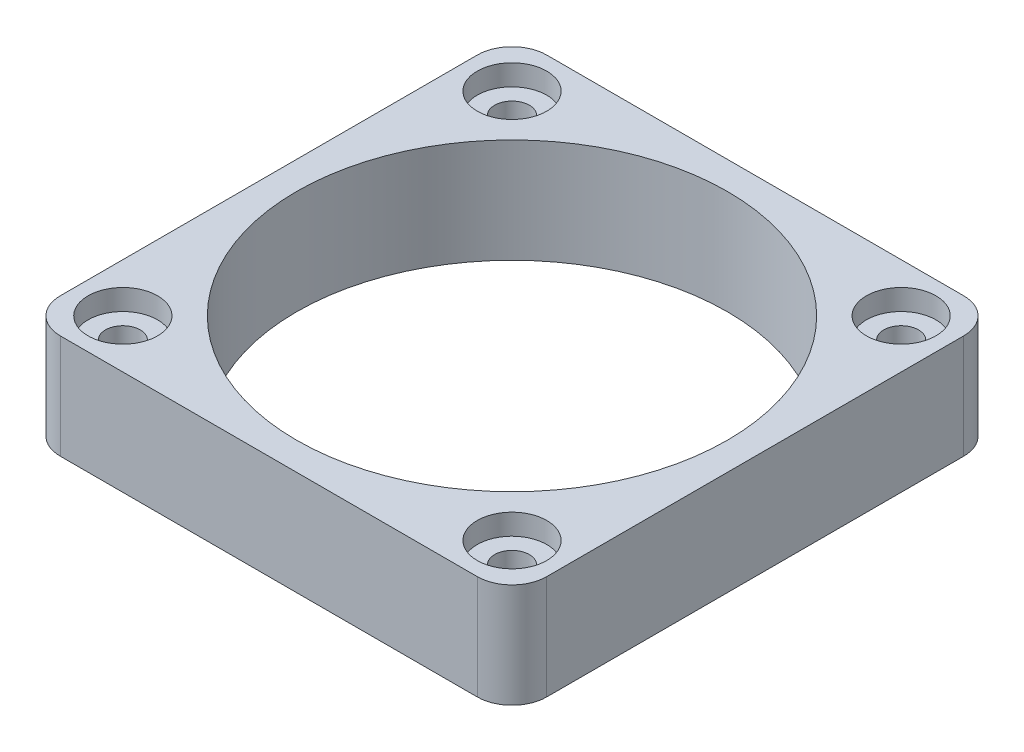
ISO-10303-21;
HEADER;
FILE_DESCRIPTION(('STEP AP214'),'2;1');
FILE_NAME('part.step','',(''),(''),'','','');
FILE_SCHEMA(('AUTOMOTIVE_DESIGN { 1 0 10303 214 1 1 1 1 }'));
ENDSEC;
DATA;
#1=APPLICATION_CONTEXT('core data for automotive mechanical design processes');
#2=APPLICATION_PROTOCOL_DEFINITION('international standard','automotive_design',2000,#1);
#3=PRODUCT_CONTEXT('',#1,'mechanical');
#4=PRODUCT('Part','Part','',(#3));
#5=PRODUCT_RELATED_PRODUCT_CATEGORY('part','',(#4));
#6=PRODUCT_DEFINITION_FORMATION('','',#4);
#7=PRODUCT_DEFINITION_CONTEXT('part definition',#1,'design');
#8=PRODUCT_DEFINITION('design','',#6,#7);
#9=PRODUCT_DEFINITION_SHAPE('','',#8);
#10=(LENGTH_UNIT() NAMED_UNIT(*) SI_UNIT(.MILLI.,.METRE.));
#11=(NAMED_UNIT(*) PLANE_ANGLE_UNIT() SI_UNIT($,.RADIAN.));
#12=(NAMED_UNIT(*) SI_UNIT($,.STERADIAN.) SOLID_ANGLE_UNIT());
#13=UNCERTAINTY_MEASURE_WITH_UNIT(LENGTH_MEASURE(1.E-05),#10,'distance_accuracy_value','');
#14=(GEOMETRIC_REPRESENTATION_CONTEXT(3) GLOBAL_UNCERTAINTY_ASSIGNED_CONTEXT((#13)) GLOBAL_UNIT_ASSIGNED_CONTEXT((#10,
#11,#12)) REPRESENTATION_CONTEXT('',''));
#15=CARTESIAN_POINT('',(0.,0.,0.));
#16=DIRECTION('',(0.,0.,1.));
#17=DIRECTION('',(1.,0.,0.));
#18=AXIS2_PLACEMENT_3D('',#15,#16,#17);
#19=CARTESIAN_POINT('',(-28.,0.,-28.));
#20=DIRECTION('',(0.,1.,0.));
#21=DIRECTION('',(0.,0.,1.));
#22=AXIS2_PLACEMENT_3D('',#19,#20,#21);
#23=CYLINDRICAL_SURFACE('',#22,2.5);
#24=CARTESIAN_POINT('',(-28.,0.,-28.));
#25=DIRECTION('',(0.,1.,0.));
#26=DIRECTION('',(0.,0.,1.));
#27=AXIS2_PLACEMENT_3D('',#24,#25,#26);
#28=CIRCLE('',#27,2.5);
#29=CARTESIAN_POINT('',(-28.,0.,-25.5));
#30=VERTEX_POINT('',#29);
#31=EDGE_CURVE('E213',#30,#30,#28,.T.);
#32=ORIENTED_EDGE('',*,*,#31,.F.);
#33=EDGE_LOOP('',(#32));
#34=FACE_BOUND('',#33,.T.);
#35=CARTESIAN_POINT('',(-28.,12.,-28.));
#36=DIRECTION('',(0.,1.,0.));
#37=DIRECTION('',(0.,0.,1.));
#38=AXIS2_PLACEMENT_3D('',#35,#36,#37);
#39=CIRCLE('',#38,2.5);
#40=CARTESIAN_POINT('',(-28.,12.,-25.5));
#41=VERTEX_POINT('',#40);
#42=EDGE_CURVE('E43',#41,#41,#39,.F.);
#43=ORIENTED_EDGE('',*,*,#42,.F.);
#44=EDGE_LOOP('',(#43));
#45=FACE_BOUND('',#44,.T.);
#46=ADVANCED_FACE('F39',(#34,#45),#23,.F.);
#47=CARTESIAN_POINT('',(28.,0.,28.));
#48=DIRECTION('',(0.,1.,0.));
#49=DIRECTION('',(0.,0.,1.));
#50=AXIS2_PLACEMENT_3D('',#47,#48,#49);
#51=CYLINDRICAL_SURFACE('',#50,2.50000000000001);
#52=CARTESIAN_POINT('',(28.,0.,28.));
#53=DIRECTION('',(0.,1.,0.));
#54=DIRECTION('',(0.,0.,1.));
#55=AXIS2_PLACEMENT_3D('',#52,#53,#54);
#56=CIRCLE('',#55,2.50000000000001);
#57=CARTESIAN_POINT('',(28.,0.,30.5));
#58=VERTEX_POINT('',#57);
#59=EDGE_CURVE('E203',#58,#58,#56,.T.);
#60=ORIENTED_EDGE('',*,*,#59,.F.);
#61=EDGE_LOOP('',(#60));
#62=FACE_BOUND('',#61,.T.);
#63=CARTESIAN_POINT('',(28.,12.,28.));
#64=DIRECTION('',(0.,1.,0.));
#65=DIRECTION('',(0.,0.,1.));
#66=AXIS2_PLACEMENT_3D('',#63,#64,#65);
#67=CIRCLE('',#66,2.50000000000001);
#68=CARTESIAN_POINT('',(28.,12.,30.5));
#69=VERTEX_POINT('',#68);
#70=EDGE_CURVE('E187',#69,#69,#67,.F.);
#71=ORIENTED_EDGE('',*,*,#70,.F.);
#72=EDGE_LOOP('',(#71));
#73=FACE_BOUND('',#72,.T.);
#74=ADVANCED_FACE('F262',(#62,#73),#51,.F.);
#75=CARTESIAN_POINT('',(0.,15.,0.));
#76=DIRECTION('',(0.,1.,0.));
#77=DIRECTION('',(0.,0.,1.));
#78=AXIS2_PLACEMENT_3D('',#75,#76,#77);
#79=PLANE('',#78);
#80=CARTESIAN_POINT('',(-28.,15.,28.));
#81=DIRECTION('',(0.,1.,0.));
#82=DIRECTION('',(0.,0.,-1.));
#83=AXIS2_PLACEMENT_3D('',#80,#81,#82);
#84=CIRCLE('',#83,5.);
#85=CARTESIAN_POINT('',(-28.,15.,23.));
#86=VERTEX_POINT('',#85);
#87=EDGE_CURVE('E374',#86,#86,#84,.T.);
#88=ORIENTED_EDGE('',*,*,#87,.F.);
#89=EDGE_LOOP('',(#88));
#90=FACE_BOUND('',#89,.T.);
#91=CARTESIAN_POINT('',(28.,15.,-28.));
#92=DIRECTION('',(0.,1.,0.));
#93=DIRECTION('',(0.,0.,-1.));
#94=AXIS2_PLACEMENT_3D('',#91,#92,#93);
#95=CIRCLE('',#94,5.);
#96=CARTESIAN_POINT('',(28.,15.,-33.));
#97=VERTEX_POINT('',#96);
#98=EDGE_CURVE('E358',#97,#97,#95,.T.);
#99=ORIENTED_EDGE('',*,*,#98,.F.);
#100=EDGE_LOOP('',(#99));
#101=FACE_BOUND('',#100,.T.);
#102=CARTESIAN_POINT('',(28.,15.,28.));
#103=DIRECTION('',(0.,1.,0.));
#104=DIRECTION('',(0.,0.,1.));
#105=AXIS2_PLACEMENT_3D('',#102,#103,#104);
#106=CIRCLE('',#105,5.);
#107=CARTESIAN_POINT('',(28.,15.,33.));
#108=VERTEX_POINT('',#107);
#109=EDGE_CURVE('E359',#108,#108,#106,.T.);
#110=ORIENTED_EDGE('',*,*,#109,.F.);
#111=EDGE_LOOP('',(#110));
#112=FACE_BOUND('',#111,.T.);
#113=CARTESIAN_POINT('',(-28.,15.,-28.));
#114=DIRECTION('',(0.,1.,0.));
#115=DIRECTION('',(0.,0.,1.));
#116=AXIS2_PLACEMENT_3D('',#113,#114,#115);
#117=CIRCLE('',#116,5.);
#118=CARTESIAN_POINT('',(-28.,15.,-23.));
#119=VERTEX_POINT('',#118);
#120=EDGE_CURVE('E373',#119,#119,#117,.T.);
#121=ORIENTED_EDGE('',*,*,#120,.F.);
#122=EDGE_LOOP('',(#121));
#123=FACE_BOUND('',#122,.T.);
#124=DIRECTION('',(-1.,0.,0.));
#125=VECTOR('',#124,1.);
#126=CARTESIAN_POINT('',(-35.,15.,-35.));
#127=LINE('',#126,#125);
#128=CARTESIAN_POINT('',(30.,15.,-35.));
#129=VERTEX_POINT('',#128);
#130=CARTESIAN_POINT('',(-30.,15.,-35.));
#131=VERTEX_POINT('',#130);
#132=EDGE_CURVE('E228',#129,#131,#127,.T.);
#133=ORIENTED_EDGE('',*,*,#132,.T.);
#134=CARTESIAN_POINT('',(-30.,15.,-30.));
#135=DIRECTION('',(0.,1.,0.));
#136=DIRECTION('',(0.,0.,1.));
#137=AXIS2_PLACEMENT_3D('',#134,#135,#136);
#138=CIRCLE('',#137,5.);
#139=CARTESIAN_POINT('',(-35.,15.,-30.));
#140=VERTEX_POINT('',#139);
#141=EDGE_CURVE('E170',#131,#140,#138,.T.);
#142=ORIENTED_EDGE('',*,*,#141,.T.);
#143=DIRECTION('',(0.,0.,1.));
#144=VECTOR('',#143,1.);
#145=CARTESIAN_POINT('',(-35.,15.,-35.));
#146=LINE('',#145,#144);
#147=CARTESIAN_POINT('',(-35.,15.,30.));
#148=VERTEX_POINT('',#147);
#149=EDGE_CURVE('E127',#140,#148,#146,.T.);
#150=ORIENTED_EDGE('',*,*,#149,.T.);
#151=CARTESIAN_POINT('',(-30.,15.,30.));
#152=DIRECTION('',(0.,1.,0.));
#153=DIRECTION('',(0.,0.,1.));
#154=AXIS2_PLACEMENT_3D('',#151,#152,#153);
#155=CIRCLE('',#154,5.);
#156=CARTESIAN_POINT('',(-30.,15.,35.));
#157=VERTEX_POINT('',#156);
#158=EDGE_CURVE('E62',#148,#157,#155,.T.);
#159=ORIENTED_EDGE('',*,*,#158,.T.);
#160=DIRECTION('',(1.,0.,0.));
#161=VECTOR('',#160,1.);
#162=CARTESIAN_POINT('',(-35.,15.,35.));
#163=LINE('',#162,#161);
#164=CARTESIAN_POINT('',(30.,15.,35.));
#165=VERTEX_POINT('',#164);
#166=EDGE_CURVE('E148',#157,#165,#163,.T.);
#167=ORIENTED_EDGE('',*,*,#166,.T.);
#168=CARTESIAN_POINT('',(30.,15.,30.));
#169=DIRECTION('',(0.,1.,0.));
#170=DIRECTION('',(0.,0.,1.));
#171=AXIS2_PLACEMENT_3D('',#168,#169,#170);
#172=CIRCLE('',#171,5.);
#173=CARTESIAN_POINT('',(35.,15.,30.));
#174=VERTEX_POINT('',#173);
#175=EDGE_CURVE('E164',#165,#174,#172,.T.);
#176=ORIENTED_EDGE('',*,*,#175,.T.);
#177=DIRECTION('',(0.,0.,-1.));
#178=VECTOR('',#177,1.);
#179=CARTESIAN_POINT('',(35.,15.,-35.));
#180=LINE('',#179,#178);
#181=CARTESIAN_POINT('',(35.,15.,-30.));
#182=VERTEX_POINT('',#181);
#183=EDGE_CURVE('E141',#174,#182,#180,.T.);
#184=ORIENTED_EDGE('',*,*,#183,.T.);
#185=CARTESIAN_POINT('',(30.,15.,-30.));
#186=DIRECTION('',(0.,1.,0.));
#187=DIRECTION('',(0.,0.,1.));
#188=AXIS2_PLACEMENT_3D('',#185,#186,#187);
#189=CIRCLE('',#188,5.);
#190=EDGE_CURVE('E167',#182,#129,#189,.T.);
#191=ORIENTED_EDGE('',*,*,#190,.T.);
#192=EDGE_LOOP('',(#133,#142,#150,#159,#167,#176,#184,#191));
#193=FACE_BOUND('',#192,.T.);
#194=CARTESIAN_POINT('',(0.,15.,0.));
#195=DIRECTION('',(0.,1.,0.));
#196=DIRECTION('',(0.,0.,1.));
#197=AXIS2_PLACEMENT_3D('',#194,#195,#196);
#198=CIRCLE('',#197,31.);
#199=CARTESIAN_POINT('',(0.,15.,31.));
#200=VERTEX_POINT('',#199);
#201=EDGE_CURVE('E218',#200,#200,#198,.T.);
#202=ORIENTED_EDGE('',*,*,#201,.F.);
#203=EDGE_LOOP('',(#202));
#204=FACE_BOUND('',#203,.T.);
#205=ADVANCED_FACE('F248',(#90,#101,#112,#123,#193,#204),#79,.T.);
#206=CARTESIAN_POINT('',(0.,0.,0.));
#207=DIRECTION('',(0.,1.,0.));
#208=DIRECTION('',(0.,0.,1.));
#209=AXIS2_PLACEMENT_3D('',#206,#207,#208);
#210=PLANE('',#209);
#211=CARTESIAN_POINT('',(-28.,0.,28.));
#212=DIRECTION('',(0.,1.,0.));
#213=DIRECTION('',(0.,0.,-1.));
#214=AXIS2_PLACEMENT_3D('',#211,#212,#213);
#215=CIRCLE('',#214,2.5);
#216=CARTESIAN_POINT('',(-28.,0.,25.5));
#217=VERTEX_POINT('',#216);
#218=EDGE_CURVE('E198',#217,#217,#215,.T.);
#219=ORIENTED_EDGE('',*,*,#218,.T.);
#220=EDGE_LOOP('',(#219));
#221=FACE_BOUND('',#220,.T.);
#222=ORIENTED_EDGE('',*,*,#59,.T.);
#223=EDGE_LOOP('',(#222));
#224=FACE_BOUND('',#223,.T.);
#225=CARTESIAN_POINT('',(28.,0.,-28.));
#226=DIRECTION('',(0.,1.,0.));
#227=DIRECTION('',(0.,0.,-1.));
#228=AXIS2_PLACEMENT_3D('',#225,#226,#227);
#229=CIRCLE('',#228,2.50000000000001);
#230=CARTESIAN_POINT('',(28.,0.,-30.5));
#231=VERTEX_POINT('',#230);
#232=EDGE_CURVE('E209',#231,#231,#229,.T.);
#233=ORIENTED_EDGE('',*,*,#232,.T.);
#234=EDGE_LOOP('',(#233));
#235=FACE_BOUND('',#234,.T.);
#236=ORIENTED_EDGE('',*,*,#31,.T.);
#237=EDGE_LOOP('',(#236));
#238=FACE_BOUND('',#237,.T.);
#239=DIRECTION('',(0.,0.,1.));
#240=VECTOR('',#239,1.);
#241=CARTESIAN_POINT('',(-35.,0.,-35.));
#242=LINE('',#241,#240);
#243=CARTESIAN_POINT('',(-35.,0.,-30.));
#244=VERTEX_POINT('',#243);
#245=CARTESIAN_POINT('',(-35.,0.,30.));
#246=VERTEX_POINT('',#245);
#247=EDGE_CURVE('E125',#244,#246,#242,.T.);
#248=ORIENTED_EDGE('',*,*,#247,.F.);
#249=CARTESIAN_POINT('',(-30.,0.,-30.));
#250=DIRECTION('',(0.,1.,0.));
#251=DIRECTION('',(0.,0.,1.));
#252=AXIS2_PLACEMENT_3D('',#249,#250,#251);
#253=CIRCLE('',#252,5.);
#254=CARTESIAN_POINT('',(-30.,0.,-35.));
#255=VERTEX_POINT('',#254);
#256=EDGE_CURVE('E107',#244,#255,#253,.F.);
#257=ORIENTED_EDGE('',*,*,#256,.T.);
#258=DIRECTION('',(-1.,0.,0.));
#259=VECTOR('',#258,1.);
#260=CARTESIAN_POINT('',(-35.,0.,-35.));
#261=LINE('',#260,#259);
#262=CARTESIAN_POINT('',(30.,0.,-35.));
#263=VERTEX_POINT('',#262);
#264=EDGE_CURVE('E137',#263,#255,#261,.T.);
#265=ORIENTED_EDGE('',*,*,#264,.F.);
#266=CARTESIAN_POINT('',(30.,0.,-30.));
#267=DIRECTION('',(0.,1.,0.));
#268=DIRECTION('',(0.,0.,1.));
#269=AXIS2_PLACEMENT_3D('',#266,#267,#268);
#270=CIRCLE('',#269,5.);
#271=CARTESIAN_POINT('',(35.,0.,-30.));
#272=VERTEX_POINT('',#271);
#273=EDGE_CURVE('E119',#263,#272,#270,.F.);
#274=ORIENTED_EDGE('',*,*,#273,.T.);
#275=DIRECTION('',(0.,0.,-1.));
#276=VECTOR('',#275,1.);
#277=CARTESIAN_POINT('',(35.,0.,-35.));
#278=LINE('',#277,#276);
#279=CARTESIAN_POINT('',(35.,0.,30.));
#280=VERTEX_POINT('',#279);
#281=EDGE_CURVE('E143',#280,#272,#278,.T.);
#282=ORIENTED_EDGE('',*,*,#281,.F.);
#283=CARTESIAN_POINT('',(30.,0.,30.));
#284=DIRECTION('',(0.,1.,0.));
#285=DIRECTION('',(0.,0.,1.));
#286=AXIS2_PLACEMENT_3D('',#283,#284,#285);
#287=CIRCLE('',#286,5.);
#288=CARTESIAN_POINT('',(30.,0.,35.));
#289=VERTEX_POINT('',#288);
#290=EDGE_CURVE('E152',#280,#289,#287,.F.);
#291=ORIENTED_EDGE('',*,*,#290,.T.);
#292=DIRECTION('',(1.,0.,0.));
#293=VECTOR('',#292,1.);
#294=CARTESIAN_POINT('',(-35.,0.,35.));
#295=LINE('',#294,#293);
#296=CARTESIAN_POINT('',(-30.,0.,35.));
#297=VERTEX_POINT('',#296);
#298=EDGE_CURVE('E136',#297,#289,#295,.T.);
#299=ORIENTED_EDGE('',*,*,#298,.F.);
#300=CARTESIAN_POINT('',(-30.,0.,30.));
#301=DIRECTION('',(0.,1.,0.));
#302=DIRECTION('',(0.,0.,1.));
#303=AXIS2_PLACEMENT_3D('',#300,#301,#302);
#304=CIRCLE('',#303,5.);
#305=EDGE_CURVE('E129',#297,#246,#304,.F.);
#306=ORIENTED_EDGE('',*,*,#305,.T.);
#307=EDGE_LOOP('',(#248,#257,#265,#274,#282,#291,#299,#306));
#308=FACE_BOUND('',#307,.T.);
#309=CARTESIAN_POINT('',(0.,0.,0.));
#310=DIRECTION('',(0.,1.,0.));
#311=DIRECTION('',(0.,0.,1.));
#312=AXIS2_PLACEMENT_3D('',#309,#310,#311);
#313=CIRCLE('',#312,31.);
#314=CARTESIAN_POINT('',(0.,0.,31.));
#315=VERTEX_POINT('',#314);
#316=EDGE_CURVE('E217',#315,#315,#313,.T.);
#317=ORIENTED_EDGE('',*,*,#316,.T.);
#318=EDGE_LOOP('',(#317));
#319=FACE_BOUND('',#318,.T.);
#320=ADVANCED_FACE('F132',(#221,#224,#235,#238,#308,#319),#210,.F.);
#321=CARTESIAN_POINT('',(35.,15.,-35.));
#322=DIRECTION('',(-1.,0.,0.));
#323=DIRECTION('',(0.,0.,1.));
#324=AXIS2_PLACEMENT_3D('',#321,#322,#323);
#325=PLANE('',#324);
#326=ORIENTED_EDGE('',*,*,#281,.T.);
#327=DIRECTION('',(0.,-1.,0.));
#328=VECTOR('',#327,1.);
#329=CARTESIAN_POINT('',(35.,15.,-30.));
#330=LINE('',#329,#328);
#331=EDGE_CURVE('E177',#272,#182,#330,.F.);
#332=ORIENTED_EDGE('',*,*,#331,.T.);
#333=ORIENTED_EDGE('',*,*,#183,.F.);
#334=DIRECTION('',(0.,-1.,0.));
#335=VECTOR('',#334,1.);
#336=CARTESIAN_POINT('',(35.,15.,30.));
#337=LINE('',#336,#335);
#338=EDGE_CURVE('E173',#174,#280,#337,.T.);
#339=ORIENTED_EDGE('',*,*,#338,.T.);
#340=EDGE_LOOP('',(#326,#332,#333,#339));
#341=FACE_BOUND('',#340,.T.);
#342=ADVANCED_FACE('F240',(#341),#325,.F.);
#343=CARTESIAN_POINT('',(-35.,15.,-35.));
#344=DIRECTION('',(0.,0.,1.));
#345=DIRECTION('',(1.,0.,0.));
#346=AXIS2_PLACEMENT_3D('',#343,#344,#345);
#347=PLANE('',#346);
#348=ORIENTED_EDGE('',*,*,#264,.T.);
#349=DIRECTION('',(0.,-1.,0.));
#350=VECTOR('',#349,1.);
#351=CARTESIAN_POINT('',(-30.,15.,-35.));
#352=LINE('',#351,#350);
#353=EDGE_CURVE('E112',#255,#131,#352,.F.);
#354=ORIENTED_EDGE('',*,*,#353,.T.);
#355=ORIENTED_EDGE('',*,*,#132,.F.);
#356=DIRECTION('',(0.,-1.,0.));
#357=VECTOR('',#356,1.);
#358=CARTESIAN_POINT('',(30.,15.,-35.));
#359=LINE('',#358,#357);
#360=EDGE_CURVE('E118',#129,#263,#359,.T.);
#361=ORIENTED_EDGE('',*,*,#360,.T.);
#362=EDGE_LOOP('',(#348,#354,#355,#361));
#363=FACE_BOUND('',#362,.T.);
#364=ADVANCED_FACE('F251',(#363),#347,.F.);
#365=CARTESIAN_POINT('',(-35.,15.,-35.));
#366=DIRECTION('',(1.,0.,0.));
#367=DIRECTION('',(0.,0.,-1.));
#368=AXIS2_PLACEMENT_3D('',#365,#366,#367);
#369=PLANE('',#368);
#370=ORIENTED_EDGE('',*,*,#149,.F.);
#371=DIRECTION('',(0.,-1.,0.));
#372=VECTOR('',#371,1.);
#373=CARTESIAN_POINT('',(-35.,15.,-30.));
#374=LINE('',#373,#372);
#375=EDGE_CURVE('E111',#140,#244,#374,.T.);
#376=ORIENTED_EDGE('',*,*,#375,.T.);
#377=ORIENTED_EDGE('',*,*,#247,.T.);
#378=DIRECTION('',(0.,-1.,0.));
#379=VECTOR('',#378,1.);
#380=CARTESIAN_POINT('',(-35.,15.,30.));
#381=LINE('',#380,#379);
#382=EDGE_CURVE('E130',#246,#148,#381,.F.);
#383=ORIENTED_EDGE('',*,*,#382,.T.);
#384=EDGE_LOOP('',(#370,#376,#377,#383));
#385=FACE_BOUND('',#384,.T.);
#386=ADVANCED_FACE('F124',(#385),#369,.F.);
#387=CARTESIAN_POINT('',(-35.,15.,35.));
#388=DIRECTION('',(0.,0.,-1.));
#389=DIRECTION('',(-1.,0.,0.));
#390=AXIS2_PLACEMENT_3D('',#387,#388,#389);
#391=PLANE('',#390);
#392=ORIENTED_EDGE('',*,*,#298,.T.);
#393=DIRECTION('',(0.,-1.,0.));
#394=VECTOR('',#393,1.);
#395=CARTESIAN_POINT('',(30.,15.,35.));
#396=LINE('',#395,#394);
#397=EDGE_CURVE('E11',#289,#165,#396,.F.);
#398=ORIENTED_EDGE('',*,*,#397,.T.);
#399=ORIENTED_EDGE('',*,*,#166,.F.);
#400=DIRECTION('',(0.,-1.,0.));
#401=VECTOR('',#400,1.);
#402=CARTESIAN_POINT('',(-30.,15.,35.));
#403=LINE('',#402,#401);
#404=EDGE_CURVE('E49',#157,#297,#403,.T.);
#405=ORIENTED_EDGE('',*,*,#404,.T.);
#406=EDGE_LOOP('',(#392,#398,#399,#405));
#407=FACE_BOUND('',#406,.T.);
#408=ADVANCED_FACE('F258',(#407),#391,.F.);
#409=CARTESIAN_POINT('',(0.,15.,0.));
#410=DIRECTION('',(0.,-1.,0.));
#411=DIRECTION('',(0.,0.,-1.));
#412=AXIS2_PLACEMENT_3D('',#409,#410,#411);
#413=CYLINDRICAL_SURFACE('',#412,31.);
#414=ORIENTED_EDGE('',*,*,#201,.T.);
#415=EDGE_LOOP('',(#414));
#416=FACE_BOUND('',#415,.T.);
#417=ORIENTED_EDGE('',*,*,#316,.F.);
#418=EDGE_LOOP('',(#417));
#419=FACE_BOUND('',#418,.T.);
#420=ADVANCED_FACE('F275',(#416,#419),#413,.F.);
#421=CARTESIAN_POINT('',(28.,0.,-28.));
#422=DIRECTION('',(0.,1.,0.));
#423=DIRECTION('',(0.,0.,1.));
#424=AXIS2_PLACEMENT_3D('',#421,#422,#423);
#425=CYLINDRICAL_SURFACE('',#424,2.50000000000001);
#426=CARTESIAN_POINT('',(28.,12.,-28.));
#427=DIRECTION('',(0.,-1.,0.));
#428=DIRECTION('',(0.,0.,-1.));
#429=AXIS2_PLACEMENT_3D('',#426,#427,#428);
#430=CIRCLE('',#429,2.50000000000001);
#431=CARTESIAN_POINT('',(28.,12.,-30.5));
#432=VERTEX_POINT('',#431);
#433=EDGE_CURVE('E191',#432,#432,#430,.F.);
#434=ORIENTED_EDGE('',*,*,#433,.T.);
#435=EDGE_LOOP('',(#434));
#436=FACE_BOUND('',#435,.T.);
#437=ORIENTED_EDGE('',*,*,#232,.F.);
#438=EDGE_LOOP('',(#437));
#439=FACE_BOUND('',#438,.T.);
#440=ADVANCED_FACE('F278',(#436,#439),#425,.F.);
#441=CARTESIAN_POINT('',(-28.,0.,28.));
#442=DIRECTION('',(0.,1.,0.));
#443=DIRECTION('',(0.,0.,1.));
#444=AXIS2_PLACEMENT_3D('',#441,#442,#443);
#445=CYLINDRICAL_SURFACE('',#444,2.5);
#446=CARTESIAN_POINT('',(-28.,12.,28.));
#447=DIRECTION('',(0.,-1.,0.));
#448=DIRECTION('',(0.,0.,-1.));
#449=AXIS2_PLACEMENT_3D('',#446,#447,#448);
#450=CIRCLE('',#449,2.5);
#451=CARTESIAN_POINT('',(-28.,12.,25.5));
#452=VERTEX_POINT('',#451);
#453=EDGE_CURVE('E183',#452,#452,#450,.F.);
#454=ORIENTED_EDGE('',*,*,#453,.T.);
#455=EDGE_LOOP('',(#454));
#456=FACE_BOUND('',#455,.T.);
#457=ORIENTED_EDGE('',*,*,#218,.F.);
#458=EDGE_LOOP('',(#457));
#459=FACE_BOUND('',#458,.T.);
#460=ADVANCED_FACE('F274',(#456,#459),#445,.F.);
#461=CARTESIAN_POINT('',(-30.,15.,-30.));
#462=DIRECTION('',(0.,-1.,0.));
#463=DIRECTION('',(0.,0.,-1.));
#464=AXIS2_PLACEMENT_3D('',#461,#462,#463);
#465=CYLINDRICAL_SURFACE('',#464,5.);
#466=ORIENTED_EDGE('',*,*,#141,.F.);
#467=ORIENTED_EDGE('',*,*,#353,.F.);
#468=ORIENTED_EDGE('',*,*,#256,.F.);
#469=ORIENTED_EDGE('',*,*,#375,.F.);
#470=EDGE_LOOP('',(#466,#467,#468,#469));
#471=FACE_BOUND('',#470,.T.);
#472=ADVANCED_FACE('F110',(#471),#465,.T.);
#473=CARTESIAN_POINT('',(30.,15.,-30.));
#474=DIRECTION('',(0.,-1.,0.));
#475=DIRECTION('',(0.,0.,-1.));
#476=AXIS2_PLACEMENT_3D('',#473,#474,#475);
#477=CYLINDRICAL_SURFACE('',#476,5.);
#478=ORIENTED_EDGE('',*,*,#190,.F.);
#479=ORIENTED_EDGE('',*,*,#331,.F.);
#480=ORIENTED_EDGE('',*,*,#273,.F.);
#481=ORIENTED_EDGE('',*,*,#360,.F.);
#482=EDGE_LOOP('',(#478,#479,#480,#481));
#483=FACE_BOUND('',#482,.T.);
#484=ADVANCED_FACE('F245',(#483),#477,.T.);
#485=CARTESIAN_POINT('',(30.,15.,30.));
#486=DIRECTION('',(0.,-1.,0.));
#487=DIRECTION('',(0.,0.,-1.));
#488=AXIS2_PLACEMENT_3D('',#485,#486,#487);
#489=CYLINDRICAL_SURFACE('',#488,5.);
#490=ORIENTED_EDGE('',*,*,#175,.F.);
#491=ORIENTED_EDGE('',*,*,#397,.F.);
#492=ORIENTED_EDGE('',*,*,#290,.F.);
#493=ORIENTED_EDGE('',*,*,#338,.F.);
#494=EDGE_LOOP('',(#490,#491,#492,#493));
#495=FACE_BOUND('',#494,.T.);
#496=ADVANCED_FACE('F291',(#495),#489,.T.);
#497=CARTESIAN_POINT('',(-30.,15.,30.));
#498=DIRECTION('',(0.,-1.,0.));
#499=DIRECTION('',(0.,0.,-1.));
#500=AXIS2_PLACEMENT_3D('',#497,#498,#499);
#501=CYLINDRICAL_SURFACE('',#500,5.);
#502=ORIENTED_EDGE('',*,*,#158,.F.);
#503=ORIENTED_EDGE('',*,*,#382,.F.);
#504=ORIENTED_EDGE('',*,*,#305,.F.);
#505=ORIENTED_EDGE('',*,*,#404,.F.);
#506=EDGE_LOOP('',(#502,#503,#504,#505));
#507=FACE_BOUND('',#506,.T.);
#508=ADVANCED_FACE('F41',(#507),#501,.T.);
#509=CARTESIAN_POINT('',(-28.,12.,28.));
#510=DIRECTION('',(0.,-1.,0.));
#511=DIRECTION('',(0.,0.,-1.));
#512=AXIS2_PLACEMENT_3D('',#509,#510,#511);
#513=PLANE('',#512);
#514=CARTESIAN_POINT('',(-28.,12.,28.));
#515=DIRECTION('',(0.,1.,0.));
#516=DIRECTION('',(0.,0.,-1.));
#517=AXIS2_PLACEMENT_3D('',#514,#515,#516);
#518=CIRCLE('',#517,5.);
#519=CARTESIAN_POINT('',(-28.,12.,23.));
#520=VERTEX_POINT('',#519);
#521=EDGE_CURVE('E369',#520,#520,#518,.T.);
#522=ORIENTED_EDGE('',*,*,#521,.T.);
#523=EDGE_LOOP('',(#522));
#524=FACE_BOUND('',#523,.T.);
#525=ORIENTED_EDGE('',*,*,#453,.F.);
#526=EDGE_LOOP('',(#525));
#527=FACE_BOUND('',#526,.T.);
#528=ADVANCED_FACE('F294',(#524,#527),#513,.F.);
#529=CARTESIAN_POINT('',(-28.,12.,28.));
#530=DIRECTION('',(0.,1.,0.));
#531=DIRECTION('',(0.,0.,1.));
#532=AXIS2_PLACEMENT_3D('',#529,#530,#531);
#533=CYLINDRICAL_SURFACE('',#532,5.);
#534=ORIENTED_EDGE('',*,*,#521,.F.);
#535=EDGE_LOOP('',(#534));
#536=FACE_BOUND('',#535,.T.);
#537=ORIENTED_EDGE('',*,*,#87,.T.);
#538=EDGE_LOOP('',(#537));
#539=FACE_BOUND('',#538,.T.);
#540=ADVANCED_FACE('F299',(#536,#539),#533,.F.);
#541=CARTESIAN_POINT('',(28.,12.,28.));
#542=DIRECTION('',(0.,1.,0.));
#543=DIRECTION('',(0.,0.,1.));
#544=AXIS2_PLACEMENT_3D('',#541,#542,#543);
#545=PLANE('',#544);
#546=CARTESIAN_POINT('',(28.,12.,28.));
#547=DIRECTION('',(0.,1.,0.));
#548=DIRECTION('',(0.,0.,1.));
#549=AXIS2_PLACEMENT_3D('',#546,#547,#548);
#550=CIRCLE('',#549,5.);
#551=CARTESIAN_POINT('',(28.,12.,33.));
#552=VERTEX_POINT('',#551);
#553=EDGE_CURVE('E354',#552,#552,#550,.T.);
#554=ORIENTED_EDGE('',*,*,#553,.T.);
#555=EDGE_LOOP('',(#554));
#556=FACE_BOUND('',#555,.T.);
#557=ORIENTED_EDGE('',*,*,#70,.T.);
#558=EDGE_LOOP('',(#557));
#559=FACE_BOUND('',#558,.T.);
#560=ADVANCED_FACE('F341',(#556,#559),#545,.T.);
#561=CARTESIAN_POINT('',(28.,12.,28.));
#562=DIRECTION('',(0.,1.,0.));
#563=DIRECTION('',(0.,0.,1.));
#564=AXIS2_PLACEMENT_3D('',#561,#562,#563);
#565=CYLINDRICAL_SURFACE('',#564,5.);
#566=ORIENTED_EDGE('',*,*,#553,.F.);
#567=EDGE_LOOP('',(#566));
#568=FACE_BOUND('',#567,.T.);
#569=ORIENTED_EDGE('',*,*,#109,.T.);
#570=EDGE_LOOP('',(#569));
#571=FACE_BOUND('',#570,.T.);
#572=ADVANCED_FACE('F338',(#568,#571),#565,.F.);
#573=CARTESIAN_POINT('',(28.,12.,-28.));
#574=DIRECTION('',(0.,-1.,0.));
#575=DIRECTION('',(0.,0.,-1.));
#576=AXIS2_PLACEMENT_3D('',#573,#574,#575);
#577=PLANE('',#576);
#578=CARTESIAN_POINT('',(28.,12.,-28.));
#579=DIRECTION('',(0.,1.,0.));
#580=DIRECTION('',(0.,0.,-1.));
#581=AXIS2_PLACEMENT_3D('',#578,#579,#580);
#582=CIRCLE('',#581,5.);
#583=CARTESIAN_POINT('',(28.,12.,-33.));
#584=VERTEX_POINT('',#583);
#585=EDGE_CURVE('E364',#584,#584,#582,.T.);
#586=ORIENTED_EDGE('',*,*,#585,.T.);
#587=EDGE_LOOP('',(#586));
#588=FACE_BOUND('',#587,.T.);
#589=ORIENTED_EDGE('',*,*,#433,.F.);
#590=EDGE_LOOP('',(#589));
#591=FACE_BOUND('',#590,.T.);
#592=ADVANCED_FACE('F334',(#588,#591),#577,.F.);
#593=CARTESIAN_POINT('',(28.,12.,-28.));
#594=DIRECTION('',(0.,1.,0.));
#595=DIRECTION('',(0.,0.,1.));
#596=AXIS2_PLACEMENT_3D('',#593,#594,#595);
#597=CYLINDRICAL_SURFACE('',#596,5.);
#598=ORIENTED_EDGE('',*,*,#585,.F.);
#599=EDGE_LOOP('',(#598));
#600=FACE_BOUND('',#599,.T.);
#601=ORIENTED_EDGE('',*,*,#98,.T.);
#602=EDGE_LOOP('',(#601));
#603=FACE_BOUND('',#602,.T.);
#604=ADVANCED_FACE('F330',(#600,#603),#597,.F.);
#605=CARTESIAN_POINT('',(-28.,12.,-28.));
#606=DIRECTION('',(0.,1.,0.));
#607=DIRECTION('',(0.,0.,1.));
#608=AXIS2_PLACEMENT_3D('',#605,#606,#607);
#609=PLANE('',#608);
#610=CARTESIAN_POINT('',(-28.,12.,-28.));
#611=DIRECTION('',(0.,1.,0.));
#612=DIRECTION('',(0.,0.,1.));
#613=AXIS2_PLACEMENT_3D('',#610,#611,#612);
#614=CIRCLE('',#613,5.);
#615=CARTESIAN_POINT('',(-28.,12.,-23.));
#616=VERTEX_POINT('',#615);
#617=EDGE_CURVE('E188',#616,#616,#614,.T.);
#618=ORIENTED_EDGE('',*,*,#617,.T.);
#619=EDGE_LOOP('',(#618));
#620=FACE_BOUND('',#619,.T.);
#621=ORIENTED_EDGE('',*,*,#42,.T.);
#622=EDGE_LOOP('',(#621));
#623=FACE_BOUND('',#622,.T.);
#624=ADVANCED_FACE('F326',(#620,#623),#609,.T.);
#625=CARTESIAN_POINT('',(-28.,12.,-28.));
#626=DIRECTION('',(0.,1.,0.));
#627=DIRECTION('',(0.,0.,1.));
#628=AXIS2_PLACEMENT_3D('',#625,#626,#627);
#629=CYLINDRICAL_SURFACE('',#628,5.);
#630=ORIENTED_EDGE('',*,*,#617,.F.);
#631=EDGE_LOOP('',(#630));
#632=FACE_BOUND('',#631,.T.);
#633=ORIENTED_EDGE('',*,*,#120,.T.);
#634=EDGE_LOOP('',(#633));
#635=FACE_BOUND('',#634,.T.);
#636=ADVANCED_FACE('F323',(#632,#635),#629,.F.);
#637=CLOSED_SHELL('',(#46,#74,#205,#320,#342,#364,#386,#408,#420,#440,#460,#472,#484,#496,#508,
#528,#540,#560,#572,#592,#604,#624,#636));
#638=MANIFOLD_SOLID_BREP('B2',#637);
#639=ADVANCED_BREP_SHAPE_REPRESENTATION('',(#18,#638),#14);
#640=SHAPE_DEFINITION_REPRESENTATION(#9,#639);
ENDSEC;
END-ISO-10303-21;
